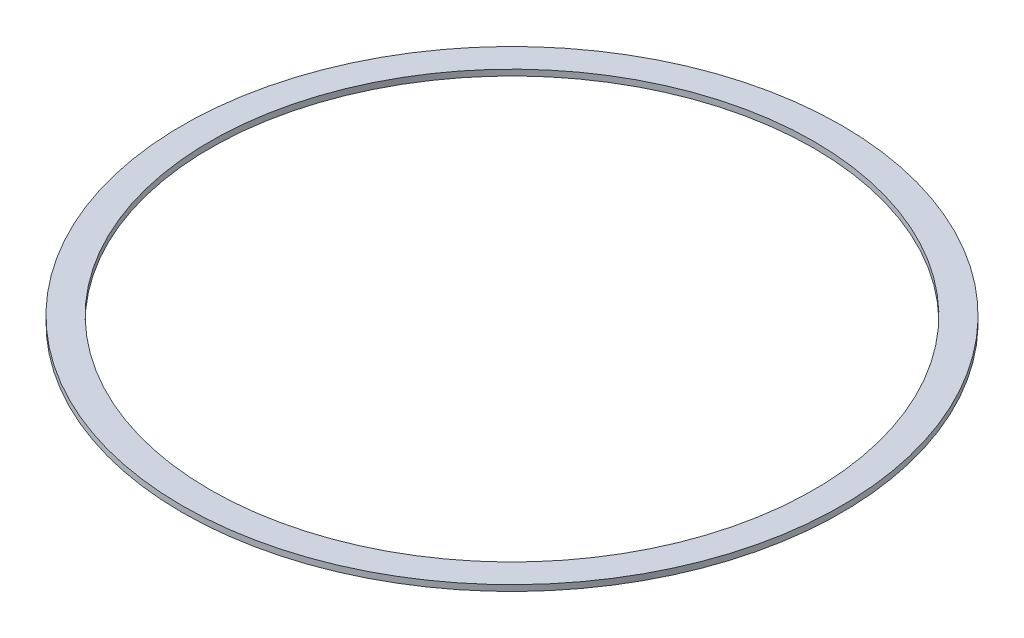
ISO-10303-21;
HEADER;
FILE_DESCRIPTION(('STEP AP214'),'2;1');
FILE_NAME('part.step','',(''),(''),'','','');
FILE_SCHEMA(('AUTOMOTIVE_DESIGN { 1 0 10303 214 1 1 1 1 }'));
ENDSEC;
DATA;
#1=APPLICATION_CONTEXT('core data for automotive mechanical design processes');
#2=APPLICATION_PROTOCOL_DEFINITION('international standard','automotive_design',2000,#1);
#3=PRODUCT_CONTEXT('',#1,'mechanical');
#4=PRODUCT('Part','Part','',(#3));
#5=PRODUCT_RELATED_PRODUCT_CATEGORY('part','',(#4));
#6=PRODUCT_DEFINITION_FORMATION('','',#4);
#7=PRODUCT_DEFINITION_CONTEXT('part definition',#1,'design');
#8=PRODUCT_DEFINITION('design','',#6,#7);
#9=PRODUCT_DEFINITION_SHAPE('','',#8);
#10=(LENGTH_UNIT() NAMED_UNIT(*) SI_UNIT(.MILLI.,.METRE.));
#11=(NAMED_UNIT(*) PLANE_ANGLE_UNIT() SI_UNIT($,.RADIAN.));
#12=(NAMED_UNIT(*) SI_UNIT($,.STERADIAN.) SOLID_ANGLE_UNIT());
#13=UNCERTAINTY_MEASURE_WITH_UNIT(LENGTH_MEASURE(1.E-05),#10,'distance_accuracy_value','');
#14=(GEOMETRIC_REPRESENTATION_CONTEXT(3) GLOBAL_UNCERTAINTY_ASSIGNED_CONTEXT((#13)) GLOBAL_UNIT_ASSIGNED_CONTEXT((#10,
#11,#12)) REPRESENTATION_CONTEXT('',''));
#15=CARTESIAN_POINT('',(0.,0.,0.));
#16=DIRECTION('',(0.,0.,1.));
#17=DIRECTION('',(1.,0.,0.));
#18=AXIS2_PLACEMENT_3D('',#15,#16,#17);
#19=CARTESIAN_POINT('',(0.,12.9615595138157,0.));
#20=DIRECTION('',(0.,1.,0.));
#21=DIRECTION('',(0.,0.,1.));
#22=AXIS2_PLACEMENT_3D('',#19,#20,#21);
#23=CYLINDRICAL_SURFACE('',#22,101.69);
#24=CARTESIAN_POINT('',(0.,-1.,0.));
#25=DIRECTION('',(0.,1.,0.));
#26=DIRECTION('',(0.,0.,1.));
#27=AXIS2_PLACEMENT_3D('',#24,#25,#26);
#28=CIRCLE('',#27,101.69);
#29=CARTESIAN_POINT('',(0.,-1.,101.69));
#30=VERTEX_POINT('',#29);
#31=EDGE_CURVE('E10',#30,#30,#28,.T.);
#32=ORIENTED_EDGE('',*,*,#31,.F.);
#33=EDGE_LOOP('',(#32));
#34=FACE_BOUND('',#33,.T.);
#35=CARTESIAN_POINT('',(0.,1.,0.));
#36=DIRECTION('',(0.,1.,0.));
#37=DIRECTION('',(0.,0.,1.));
#38=AXIS2_PLACEMENT_3D('',#35,#36,#37);
#39=CIRCLE('',#38,101.69);
#40=CARTESIAN_POINT('',(0.,1.,101.69));
#41=VERTEX_POINT('',#40);
#42=EDGE_CURVE('E49',#41,#41,#39,.T.);
#43=ORIENTED_EDGE('',*,*,#42,.T.);
#44=EDGE_LOOP('',(#43));
#45=FACE_BOUND('',#44,.T.);
#46=ADVANCED_FACE('F35',(#34,#45),#23,.F.);
#47=CARTESIAN_POINT('',(101.69,-1.,0.));
#48=DIRECTION('',(0.,1.,0.));
#49=DIRECTION('',(0.,0.,1.));
#50=AXIS2_PLACEMENT_3D('',#47,#48,#49);
#51=PLANE('',#50);
#52=CARTESIAN_POINT('',(0.,-1.,0.));
#53=DIRECTION('',(0.,1.,0.));
#54=DIRECTION('',(0.,0.,1.));
#55=AXIS2_PLACEMENT_3D('',#52,#53,#54);
#56=CIRCLE('',#55,111.035);
#57=CARTESIAN_POINT('',(0.,-1.,111.035));
#58=VERTEX_POINT('',#57);
#59=EDGE_CURVE('E41',#58,#58,#56,.T.);
#60=ORIENTED_EDGE('',*,*,#59,.F.);
#61=EDGE_LOOP('',(#60));
#62=FACE_BOUND('',#61,.T.);
#63=ORIENTED_EDGE('',*,*,#31,.T.);
#64=EDGE_LOOP('',(#63));
#65=FACE_BOUND('',#64,.T.);
#66=ADVANCED_FACE('F64',(#62,#65),#51,.F.);
#67=CARTESIAN_POINT('',(0.,12.9615595138157,0.));
#68=DIRECTION('',(0.,1.,0.));
#69=DIRECTION('',(0.,0.,1.));
#70=AXIS2_PLACEMENT_3D('',#67,#68,#69);
#71=CYLINDRICAL_SURFACE('',#70,111.035);
#72=CARTESIAN_POINT('',(0.,1.,0.));
#73=DIRECTION('',(0.,1.,0.));
#74=DIRECTION('',(0.,0.,1.));
#75=AXIS2_PLACEMENT_3D('',#72,#73,#74);
#76=CIRCLE('',#75,111.035);
#77=CARTESIAN_POINT('',(0.,1.,111.035));
#78=VERTEX_POINT('',#77);
#79=EDGE_CURVE('E45',#78,#78,#76,.T.);
#80=ORIENTED_EDGE('',*,*,#79,.F.);
#81=EDGE_LOOP('',(#80));
#82=FACE_BOUND('',#81,.T.);
#83=ORIENTED_EDGE('',*,*,#59,.T.);
#84=EDGE_LOOP('',(#83));
#85=FACE_BOUND('',#84,.T.);
#86=ADVANCED_FACE('F59',(#82,#85),#71,.T.);
#87=CARTESIAN_POINT('',(101.69,1.,0.));
#88=DIRECTION('',(0.,-1.,0.));
#89=DIRECTION('',(0.,0.,-1.));
#90=AXIS2_PLACEMENT_3D('',#87,#88,#89);
#91=PLANE('',#90);
#92=ORIENTED_EDGE('',*,*,#42,.F.);
#93=EDGE_LOOP('',(#92));
#94=FACE_BOUND('',#93,.T.);
#95=ORIENTED_EDGE('',*,*,#79,.T.);
#96=EDGE_LOOP('',(#95));
#97=FACE_BOUND('',#96,.T.);
#98=ADVANCED_FACE('F56',(#94,#97),#91,.F.);
#99=CLOSED_SHELL('',(#46,#66,#86,#98));
#100=MANIFOLD_SOLID_BREP('B2',#99);
#101=ADVANCED_BREP_SHAPE_REPRESENTATION('',(#18,#100),#14);
#102=SHAPE_DEFINITION_REPRESENTATION(#9,#101);
ENDSEC;
END-ISO-10303-21;
